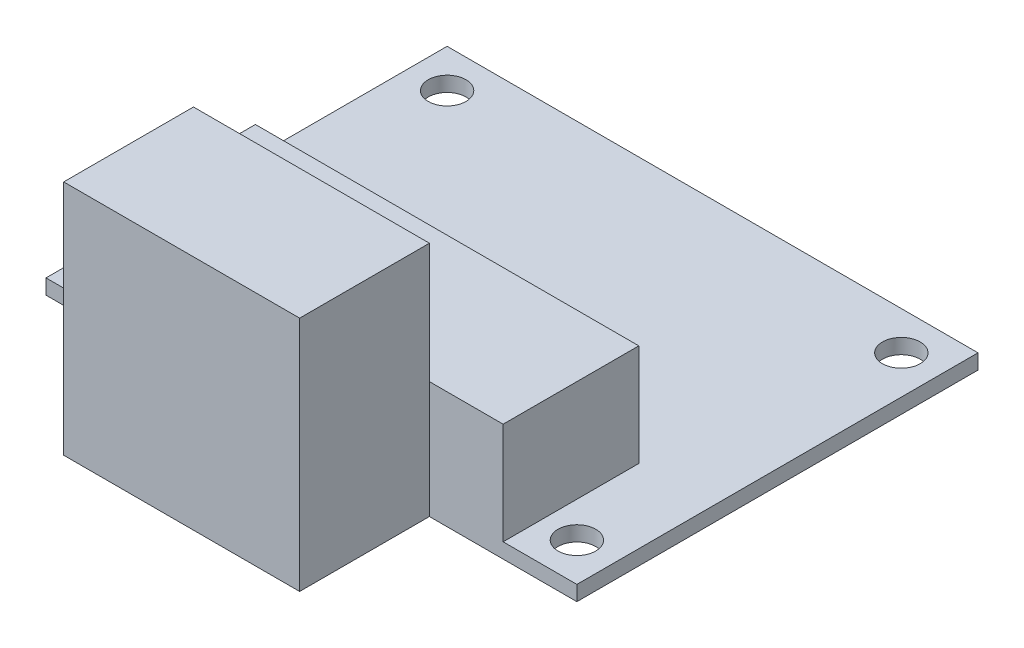
ISO-10303-21;
HEADER;
FILE_DESCRIPTION(('STEP AP214'),'2;1');
FILE_NAME('part.step','',(''),(''),'','','');
FILE_SCHEMA(('AUTOMOTIVE_DESIGN { 1 0 10303 214 1 1 1 1 }'));
ENDSEC;
DATA;
#1=APPLICATION_CONTEXT('core data for automotive mechanical design processes');
#2=APPLICATION_PROTOCOL_DEFINITION('international standard','automotive_design',2000,#1);
#3=PRODUCT_CONTEXT('',#1,'mechanical');
#4=PRODUCT('Part','Part','',(#3));
#5=PRODUCT_RELATED_PRODUCT_CATEGORY('part','',(#4));
#6=PRODUCT_DEFINITION_FORMATION('','',#4);
#7=PRODUCT_DEFINITION_CONTEXT('part definition',#1,'design');
#8=PRODUCT_DEFINITION('design','',#6,#7);
#9=PRODUCT_DEFINITION_SHAPE('','',#8);
#10=(LENGTH_UNIT() NAMED_UNIT(*) SI_UNIT(.MILLI.,.METRE.));
#11=(NAMED_UNIT(*) PLANE_ANGLE_UNIT() SI_UNIT($,.RADIAN.));
#12=(NAMED_UNIT(*) SI_UNIT($,.STERADIAN.) SOLID_ANGLE_UNIT());
#13=UNCERTAINTY_MEASURE_WITH_UNIT(LENGTH_MEASURE(1.E-05),#10,'distance_accuracy_value','');
#14=(GEOMETRIC_REPRESENTATION_CONTEXT(3) GLOBAL_UNCERTAINTY_ASSIGNED_CONTEXT((#13)) GLOBAL_UNIT_ASSIGNED_CONTEXT((#10,
#11,#12)) REPRESENTATION_CONTEXT('',''));
#15=CARTESIAN_POINT('',(0.,0.,0.));
#16=DIRECTION('',(0.,0.,1.));
#17=DIRECTION('',(1.,0.,0.));
#18=AXIS2_PLACEMENT_3D('',#15,#16,#17);
#19=CARTESIAN_POINT('',(22.5,-10.033,11.5));
#20=DIRECTION('',(0.,0.,-1.));
#21=DIRECTION('',(-1.,0.,0.));
#22=AXIS2_PLACEMENT_3D('',#19,#20,#21);
#23=PLANE('',#22);
#24=DIRECTION('',(1.,0.,0.));
#25=VECTOR('',#24,1.);
#26=CARTESIAN_POINT('',(0.,-0.127,11.5));
#27=LINE('',#26,#25);
#28=CARTESIAN_POINT('',(10.,-0.127,11.5));
#29=VERTEX_POINT('',#28);
#30=CARTESIAN_POINT('',(16.2485604026846,-0.127,11.5));
#31=VERTEX_POINT('',#30);
#32=EDGE_CURVE('E128',#29,#31,#27,.T.);
#33=ORIENTED_EDGE('',*,*,#32,.F.);
#34=DIRECTION('',(0.,1.,0.));
#35=VECTOR('',#34,1.);
#36=CARTESIAN_POINT('',(10.,-10.033,11.5));
#37=LINE('',#36,#35);
#38=CARTESIAN_POINT('',(10.,-10.033,11.5));
#39=VERTEX_POINT('',#38);
#40=EDGE_CURVE('E193',#39,#29,#37,.T.);
#41=ORIENTED_EDGE('',*,*,#40,.F.);
#42=DIRECTION('',(-1.,0.,0.));
#43=VECTOR('',#42,1.);
#44=CARTESIAN_POINT('',(22.5,-10.033,11.5));
#45=LINE('',#44,#43);
#46=CARTESIAN_POINT('',(22.5,-10.033,11.5));
#47=VERTEX_POINT('',#46);
#48=EDGE_CURVE('E180',#47,#39,#45,.T.);
#49=ORIENTED_EDGE('',*,*,#48,.F.);
#50=DIRECTION('',(0.,1.,0.));
#51=VECTOR('',#50,1.);
#52=CARTESIAN_POINT('',(22.5,-10.033,11.5));
#53=LINE('',#52,#51);
#54=CARTESIAN_POINT('',(22.5,-8.763,11.5));
#55=VERTEX_POINT('',#54);
#56=EDGE_CURVE('E186',#47,#55,#53,.T.);
#57=ORIENTED_EDGE('',*,*,#56,.T.);
#58=DIRECTION('',(1.,0.,0.));
#59=VECTOR('',#58,1.);
#60=CARTESIAN_POINT('',(0.,-8.763,11.5));
#61=LINE('',#60,#59);
#62=CARTESIAN_POINT('',(16.2485604026846,-8.763,11.5));
#63=VERTEX_POINT('',#62);
#64=EDGE_CURVE('E151',#63,#55,#61,.T.);
#65=ORIENTED_EDGE('',*,*,#64,.F.);
#66=DIRECTION('',(0.,1.,0.));
#67=VECTOR('',#66,1.);
#68=CARTESIAN_POINT('',(16.2485604026846,-8.763,11.5));
#69=LINE('',#68,#67);
#70=EDGE_CURVE('E144',#63,#31,#69,.T.);
#71=ORIENTED_EDGE('',*,*,#70,.T.);
#72=EDGE_LOOP('',(#33,#41,#49,#57,#65,#71));
#73=FACE_BOUND('',#72,.T.);
#74=ADVANCED_FACE('F34',(#73),#23,.F.);
#75=CARTESIAN_POINT('',(-22.5,-10.033,11.5));
#76=DIRECTION('',(0.,0.,1.));
#77=DIRECTION('',(1.,0.,0.));
#78=AXIS2_PLACEMENT_3D('',#75,#76,#77);
#79=PLANE('',#78);
#80=DIRECTION('',(0.,1.,0.));
#81=VECTOR('',#80,1.);
#82=CARTESIAN_POINT('',(-10.,-10.033,11.5));
#83=LINE('',#82,#81);
#84=CARTESIAN_POINT('',(-10.,-10.033,11.5));
#85=VERTEX_POINT('',#84);
#86=CARTESIAN_POINT('',(-10.,-0.127,11.5));
#87=VERTEX_POINT('',#86);
#88=EDGE_CURVE('E176',#85,#87,#83,.T.);
#89=ORIENTED_EDGE('',*,*,#88,.T.);
#90=CARTESIAN_POINT('',(-16.25,-0.127,11.5));
#91=VERTEX_POINT('',#90);
#92=EDGE_CURVE('E140',#91,#87,#27,.T.);
#93=ORIENTED_EDGE('',*,*,#92,.F.);
#94=DIRECTION('',(0.,1.,0.));
#95=VECTOR('',#94,1.);
#96=CARTESIAN_POINT('',(-16.25,-8.763,11.5));
#97=LINE('',#96,#95);
#98=CARTESIAN_POINT('',(-16.25,-8.763,11.5));
#99=VERTEX_POINT('',#98);
#100=EDGE_CURVE('E152',#99,#91,#97,.T.);
#101=ORIENTED_EDGE('',*,*,#100,.F.);
#102=DIRECTION('',(1.,0.,0.));
#103=VECTOR('',#102,1.);
#104=CARTESIAN_POINT('',(0.,-8.763,11.5));
#105=LINE('',#104,#103);
#106=CARTESIAN_POINT('',(-22.5,-8.763,11.5));
#107=VERTEX_POINT('',#106);
#108=EDGE_CURVE('E226',#107,#99,#105,.T.);
#109=ORIENTED_EDGE('',*,*,#108,.F.);
#110=DIRECTION('',(0.,1.,0.));
#111=VECTOR('',#110,1.);
#112=CARTESIAN_POINT('',(-22.5,-10.033,11.5));
#113=LINE('',#112,#111);
#114=CARTESIAN_POINT('',(-22.5,-10.033,11.5));
#115=VERTEX_POINT('',#114);
#116=EDGE_CURVE('E172',#115,#107,#113,.T.);
#117=ORIENTED_EDGE('',*,*,#116,.F.);
#118=DIRECTION('',(1.,0.,0.));
#119=VECTOR('',#118,1.);
#120=CARTESIAN_POINT('',(-22.5,-10.033,11.5));
#121=LINE('',#120,#119);
#122=EDGE_CURVE('E165',#115,#85,#121,.T.);
#123=ORIENTED_EDGE('',*,*,#122,.T.);
#124=EDGE_LOOP('',(#89,#93,#101,#109,#117,#123));
#125=FACE_BOUND('',#124,.T.);
#126=ADVANCED_FACE('F223',(#125),#79,.T.);
#127=CARTESIAN_POINT('',(16.2485604026846,-8.763,0.));
#128=DIRECTION('',(1.,0.,0.));
#129=DIRECTION('',(0.,0.,-1.));
#130=AXIS2_PLACEMENT_3D('',#127,#128,#129);
#131=PLANE('',#130);
#132=DIRECTION('',(0.,1.,0.));
#133=VECTOR('',#132,1.);
#134=CARTESIAN_POINT('',(16.2485604026846,-8.763,0.));
#135=LINE('',#134,#133);
#136=CARTESIAN_POINT('',(16.2485604026846,-8.763,0.));
#137=VERTEX_POINT('',#136);
#138=CARTESIAN_POINT('',(16.2485604026846,-0.127,0.));
#139=VERTEX_POINT('',#138);
#140=EDGE_CURVE('E147',#137,#139,#135,.T.);
#141=ORIENTED_EDGE('',*,*,#140,.T.);
#142=DIRECTION('',(0.,0.,-1.));
#143=VECTOR('',#142,1.);
#144=CARTESIAN_POINT('',(16.2485604026846,-0.127,0.));
#145=LINE('',#144,#143);
#146=EDGE_CURVE('E132',#31,#139,#145,.T.);
#147=ORIENTED_EDGE('',*,*,#146,.F.);
#148=ORIENTED_EDGE('',*,*,#70,.F.);
#149=DIRECTION('',(0.,0.,-1.));
#150=VECTOR('',#149,1.);
#151=CARTESIAN_POINT('',(16.2485604026846,-8.763,0.));
#152=LINE('',#151,#150);
#153=EDGE_CURVE('E242',#63,#137,#152,.T.);
#154=ORIENTED_EDGE('',*,*,#153,.T.);
#155=EDGE_LOOP('',(#141,#147,#148,#154));
#156=FACE_BOUND('',#155,.T.);
#157=ADVANCED_FACE('F143',(#156),#131,.T.);
#158=CARTESIAN_POINT('',(0.,-8.763,0.));
#159=DIRECTION('',(0.,0.,1.));
#160=DIRECTION('',(1.,0.,0.));
#161=AXIS2_PLACEMENT_3D('',#158,#159,#160);
#162=PLANE('',#161);
#163=DIRECTION('',(1.,0.,0.));
#164=VECTOR('',#163,1.);
#165=CARTESIAN_POINT('',(0.,-0.127,0.));
#166=LINE('',#165,#164);
#167=CARTESIAN_POINT('',(-16.25,-0.127,0.));
#168=VERTEX_POINT('',#167);
#169=EDGE_CURVE('E49',#168,#139,#166,.T.);
#170=ORIENTED_EDGE('',*,*,#169,.T.);
#171=ORIENTED_EDGE('',*,*,#140,.F.);
#172=DIRECTION('',(1.,0.,0.));
#173=VECTOR('',#172,1.);
#174=CARTESIAN_POINT('',(0.,-8.763,0.));
#175=LINE('',#174,#173);
#176=CARTESIAN_POINT('',(-16.25,-8.763,0.));
#177=VERTEX_POINT('',#176);
#178=EDGE_CURVE('E153',#177,#137,#175,.T.);
#179=ORIENTED_EDGE('',*,*,#178,.F.);
#180=DIRECTION('',(0.,1.,0.));
#181=VECTOR('',#180,1.);
#182=CARTESIAN_POINT('',(-16.25,-8.763,0.));
#183=LINE('',#182,#181);
#184=EDGE_CURVE('E156',#177,#168,#183,.T.);
#185=ORIENTED_EDGE('',*,*,#184,.T.);
#186=EDGE_LOOP('',(#170,#171,#179,#185));
#187=FACE_BOUND('',#186,.T.);
#188=ADVANCED_FACE('F237',(#187),#162,.F.);
#189=CARTESIAN_POINT('',(-16.25,-8.763,0.));
#190=DIRECTION('',(1.,0.,0.));
#191=DIRECTION('',(0.,0.,-1.));
#192=AXIS2_PLACEMENT_3D('',#189,#190,#191);
#193=PLANE('',#192);
#194=DIRECTION('',(0.,0.,-1.));
#195=VECTOR('',#194,1.);
#196=CARTESIAN_POINT('',(-16.25,-0.127,0.));
#197=LINE('',#196,#195);
#198=EDGE_CURVE('E240',#91,#168,#197,.T.);
#199=ORIENTED_EDGE('',*,*,#198,.T.);
#200=ORIENTED_EDGE('',*,*,#184,.F.);
#201=DIRECTION('',(0.,0.,-1.));
#202=VECTOR('',#201,1.);
#203=CARTESIAN_POINT('',(-16.25,-8.763,0.));
#204=LINE('',#203,#202);
#205=EDGE_CURVE('E159',#99,#177,#204,.T.);
#206=ORIENTED_EDGE('',*,*,#205,.F.);
#207=ORIENTED_EDGE('',*,*,#100,.T.);
#208=EDGE_LOOP('',(#199,#200,#206,#207));
#209=FACE_BOUND('',#208,.T.);
#210=ADVANCED_FACE('F239',(#209),#193,.F.);
#211=CARTESIAN_POINT('',(-22.5,10.033,22.5));
#212=DIRECTION('',(1.,0.,0.));
#213=DIRECTION('',(0.,0.,-1.));
#214=AXIS2_PLACEMENT_3D('',#211,#212,#213);
#215=PLANE('',#214);
#216=DIRECTION('',(0.,0.,1.));
#217=VECTOR('',#216,1.);
#218=CARTESIAN_POINT('',(-22.5,-8.763,0.));
#219=LINE('',#218,#217);
#220=CARTESIAN_POINT('',(-22.5,-8.763,-22.5));
#221=VERTEX_POINT('',#220);
#222=EDGE_CURVE('E57',#221,#107,#219,.T.);
#223=ORIENTED_EDGE('',*,*,#222,.F.);
#224=DIRECTION('',(0.,-1.,0.));
#225=VECTOR('',#224,1.);
#226=CARTESIAN_POINT('',(-22.5,10.033,-22.5));
#227=LINE('',#226,#225);
#228=CARTESIAN_POINT('',(-22.5,-10.033,-22.5));
#229=VERTEX_POINT('',#228);
#230=EDGE_CURVE('E42',#221,#229,#227,.T.);
#231=ORIENTED_EDGE('',*,*,#230,.T.);
#232=DIRECTION('',(0.,0.,1.));
#233=VECTOR('',#232,1.);
#234=CARTESIAN_POINT('',(-22.5,-10.033,22.5));
#235=LINE('',#234,#233);
#236=EDGE_CURVE('E204',#229,#115,#235,.T.);
#237=ORIENTED_EDGE('',*,*,#236,.T.);
#238=ORIENTED_EDGE('',*,*,#116,.T.);
#239=EDGE_LOOP('',(#223,#231,#237,#238));
#240=FACE_BOUND('',#239,.T.);
#241=ADVANCED_FACE('F209',(#240),#215,.F.);
#242=CARTESIAN_POINT('',(0.,10.033,0.));
#243=DIRECTION('',(0.,-1.,0.));
#244=DIRECTION('',(0.,0.,-1.));
#245=AXIS2_PLACEMENT_3D('',#242,#243,#244);
#246=PLANE('',#245);
#247=DIRECTION('',(0.,0.,1.));
#248=VECTOR('',#247,1.);
#249=CARTESIAN_POINT('',(10.,10.033,22.5));
#250=LINE('',#249,#248);
#251=CARTESIAN_POINT('',(10.,10.033,11.5));
#252=VERTEX_POINT('',#251);
#253=CARTESIAN_POINT('',(10.,10.033,22.5));
#254=VERTEX_POINT('',#253);
#255=EDGE_CURVE('E175',#252,#254,#250,.T.);
#256=ORIENTED_EDGE('',*,*,#255,.F.);
#257=DIRECTION('',(1.,0.,0.));
#258=VECTOR('',#257,1.);
#259=CARTESIAN_POINT('',(0.,10.033,11.5));
#260=LINE('',#259,#258);
#261=CARTESIAN_POINT('',(-10.,10.033,11.5));
#262=VERTEX_POINT('',#261);
#263=EDGE_CURVE('E138',#262,#252,#260,.T.);
#264=ORIENTED_EDGE('',*,*,#263,.F.);
#265=DIRECTION('',(0.,0.,1.));
#266=VECTOR('',#265,1.);
#267=CARTESIAN_POINT('',(-10.,10.033,22.5));
#268=LINE('',#267,#266);
#269=CARTESIAN_POINT('',(-10.,10.033,22.5));
#270=VERTEX_POINT('',#269);
#271=EDGE_CURVE('E166',#262,#270,#268,.T.);
#272=ORIENTED_EDGE('',*,*,#271,.T.);
#273=DIRECTION('',(1.,0.,0.));
#274=VECTOR('',#273,1.);
#275=CARTESIAN_POINT('',(-22.5,10.033,22.5));
#276=LINE('',#275,#274);
#277=EDGE_CURVE('E196',#270,#254,#276,.T.);
#278=ORIENTED_EDGE('',*,*,#277,.T.);
#279=EDGE_LOOP('',(#256,#264,#272,#278));
#280=FACE_BOUND('',#279,.T.);
#281=ADVANCED_FACE('F269',(#280),#246,.F.);
#282=CARTESIAN_POINT('',(22.5,10.033,22.5));
#283=DIRECTION('',(-1.,0.,0.));
#284=DIRECTION('',(0.,0.,1.));
#285=AXIS2_PLACEMENT_3D('',#282,#283,#284);
#286=PLANE('',#285);
#287=DIRECTION('',(0.,0.,-1.));
#288=VECTOR('',#287,1.);
#289=CARTESIAN_POINT('',(22.5,-8.763,0.));
#290=LINE('',#289,#288);
#291=CARTESIAN_POINT('',(22.5,-8.763,-22.5));
#292=VERTEX_POINT('',#291);
#293=EDGE_CURVE('E246',#55,#292,#290,.T.);
#294=ORIENTED_EDGE('',*,*,#293,.F.);
#295=ORIENTED_EDGE('',*,*,#56,.F.);
#296=DIRECTION('',(0.,0.,-1.));
#297=VECTOR('',#296,1.);
#298=CARTESIAN_POINT('',(22.5,-10.033,22.5));
#299=LINE('',#298,#297);
#300=CARTESIAN_POINT('',(22.5,-10.033,-22.5));
#301=VERTEX_POINT('',#300);
#302=EDGE_CURVE('E192',#47,#301,#299,.T.);
#303=ORIENTED_EDGE('',*,*,#302,.T.);
#304=DIRECTION('',(0.,-1.,0.));
#305=VECTOR('',#304,1.);
#306=CARTESIAN_POINT('',(22.5,10.033,-22.5));
#307=LINE('',#306,#305);
#308=EDGE_CURVE('E11',#292,#301,#307,.T.);
#309=ORIENTED_EDGE('',*,*,#308,.F.);
#310=EDGE_LOOP('',(#294,#295,#303,#309));
#311=FACE_BOUND('',#310,.T.);
#312=ADVANCED_FACE('F36',(#311),#286,.F.);
#313=CARTESIAN_POINT('',(-22.5,10.033,-22.5));
#314=DIRECTION('',(0.,0.,1.));
#315=DIRECTION('',(1.,0.,0.));
#316=AXIS2_PLACEMENT_3D('',#313,#314,#315);
#317=PLANE('',#316);
#318=DIRECTION('',(-1.,0.,0.));
#319=VECTOR('',#318,1.);
#320=CARTESIAN_POINT('',(0.,-8.763,-22.5));
#321=LINE('',#320,#319);
#322=EDGE_CURVE('E230',#292,#221,#321,.T.);
#323=ORIENTED_EDGE('',*,*,#322,.F.);
#324=ORIENTED_EDGE('',*,*,#308,.T.);
#325=DIRECTION('',(-1.,0.,0.));
#326=VECTOR('',#325,1.);
#327=CARTESIAN_POINT('',(-22.5,-10.033,-22.5));
#328=LINE('',#327,#326);
#329=EDGE_CURVE('E201',#301,#229,#328,.T.);
#330=ORIENTED_EDGE('',*,*,#329,.T.);
#331=ORIENTED_EDGE('',*,*,#230,.F.);
#332=EDGE_LOOP('',(#323,#324,#330,#331));
#333=FACE_BOUND('',#332,.T.);
#334=ADVANCED_FACE('F214',(#333),#317,.F.);
#335=CARTESIAN_POINT('',(-22.5,10.033,22.5));
#336=DIRECTION('',(0.,0.,-1.));
#337=DIRECTION('',(-1.,0.,0.));
#338=AXIS2_PLACEMENT_3D('',#335,#336,#337);
#339=PLANE('',#338);
#340=DIRECTION('',(0.,1.,0.));
#341=VECTOR('',#340,1.);
#342=CARTESIAN_POINT('',(-10.,-10.033,22.5));
#343=LINE('',#342,#341);
#344=CARTESIAN_POINT('',(-10.,-10.033,22.5));
#345=VERTEX_POINT('',#344);
#346=EDGE_CURVE('E169',#345,#270,#343,.T.);
#347=ORIENTED_EDGE('',*,*,#346,.F.);
#348=DIRECTION('',(1.,0.,0.));
#349=VECTOR('',#348,1.);
#350=CARTESIAN_POINT('',(-22.5,-10.033,22.5));
#351=LINE('',#350,#349);
#352=CARTESIAN_POINT('',(10.,-10.033,22.5));
#353=VERTEX_POINT('',#352);
#354=EDGE_CURVE('E198',#345,#353,#351,.T.);
#355=ORIENTED_EDGE('',*,*,#354,.T.);
#356=DIRECTION('',(0.,1.,0.));
#357=VECTOR('',#356,1.);
#358=CARTESIAN_POINT('',(10.,-10.033,22.5));
#359=LINE('',#358,#357);
#360=EDGE_CURVE('E189',#353,#254,#359,.T.);
#361=ORIENTED_EDGE('',*,*,#360,.T.);
#362=ORIENTED_EDGE('',*,*,#277,.F.);
#363=EDGE_LOOP('',(#347,#355,#361,#362));
#364=FACE_BOUND('',#363,.T.);
#365=ADVANCED_FACE('F262',(#364),#339,.F.);
#366=CARTESIAN_POINT('',(0.,-10.033,0.));
#367=DIRECTION('',(0.,-1.,0.));
#368=DIRECTION('',(0.,0.,-1.));
#369=AXIS2_PLACEMENT_3D('',#366,#367,#368);
#370=PLANE('',#369);
#371=CARTESIAN_POINT('',(-19.25,-10.033,-19.25));
#372=DIRECTION('',(0.,-1.,0.));
#373=DIRECTION('',(0.,0.,-1.));
#374=AXIS2_PLACEMENT_3D('',#371,#372,#373);
#375=CIRCLE('',#374,1.6);
#376=CARTESIAN_POINT('',(-19.25,-10.033,-20.85));
#377=VERTEX_POINT('',#376);
#378=EDGE_CURVE('E293',#377,#377,#375,.T.);
#379=ORIENTED_EDGE('',*,*,#378,.F.);
#380=EDGE_LOOP('',(#379));
#381=FACE_BOUND('',#380,.T.);
#382=CARTESIAN_POINT('',(-19.25,-10.033,8.25));
#383=DIRECTION('',(0.,-1.,0.));
#384=DIRECTION('',(0.,0.,-1.));
#385=AXIS2_PLACEMENT_3D('',#382,#383,#384);
#386=CIRCLE('',#385,1.6);
#387=CARTESIAN_POINT('',(-19.25,-10.033,6.65));
#388=VERTEX_POINT('',#387);
#389=EDGE_CURVE('E287',#388,#388,#386,.T.);
#390=ORIENTED_EDGE('',*,*,#389,.F.);
#391=EDGE_LOOP('',(#390));
#392=FACE_BOUND('',#391,.T.);
#393=CARTESIAN_POINT('',(19.25,-10.033,8.25));
#394=DIRECTION('',(0.,-1.,0.));
#395=DIRECTION('',(0.,0.,-1.));
#396=AXIS2_PLACEMENT_3D('',#393,#394,#395);
#397=CIRCLE('',#396,1.6);
#398=CARTESIAN_POINT('',(19.25,-10.033,6.65));
#399=VERTEX_POINT('',#398);
#400=EDGE_CURVE('E281',#399,#399,#397,.T.);
#401=ORIENTED_EDGE('',*,*,#400,.F.);
#402=EDGE_LOOP('',(#401));
#403=FACE_BOUND('',#402,.T.);
#404=CARTESIAN_POINT('',(19.25,-10.033,-19.25));
#405=DIRECTION('',(0.,-1.,0.));
#406=DIRECTION('',(0.,0.,-1.));
#407=AXIS2_PLACEMENT_3D('',#404,#405,#406);
#408=CIRCLE('',#407,1.6);
#409=CARTESIAN_POINT('',(19.25,-10.033,-20.85));
#410=VERTEX_POINT('',#409);
#411=EDGE_CURVE('E271',#410,#410,#408,.T.);
#412=ORIENTED_EDGE('',*,*,#411,.F.);
#413=EDGE_LOOP('',(#412));
#414=FACE_BOUND('',#413,.T.);
#415=DIRECTION('',(0.,0.,1.));
#416=VECTOR('',#415,1.);
#417=CARTESIAN_POINT('',(-10.,-10.033,22.5));
#418=LINE('',#417,#416);
#419=EDGE_CURVE('E163',#85,#345,#418,.T.);
#420=ORIENTED_EDGE('',*,*,#419,.F.);
#421=ORIENTED_EDGE('',*,*,#122,.F.);
#422=ORIENTED_EDGE('',*,*,#236,.F.);
#423=ORIENTED_EDGE('',*,*,#329,.F.);
#424=ORIENTED_EDGE('',*,*,#302,.F.);
#425=ORIENTED_EDGE('',*,*,#48,.T.);
#426=DIRECTION('',(0.,0.,1.));
#427=VECTOR('',#426,1.);
#428=CARTESIAN_POINT('',(10.,-10.033,22.5));
#429=LINE('',#428,#427);
#430=EDGE_CURVE('E183',#39,#353,#429,.T.);
#431=ORIENTED_EDGE('',*,*,#430,.T.);
#432=ORIENTED_EDGE('',*,*,#354,.F.);
#433=EDGE_LOOP('',(#420,#421,#422,#423,#424,#425,#431,#432));
#434=FACE_BOUND('',#433,.T.);
#435=ADVANCED_FACE('F220',(#381,#392,#403,#414,#434),#370,.T.);
#436=CARTESIAN_POINT('',(10.,-10.033,22.5));
#437=DIRECTION('',(-1.,0.,0.));
#438=DIRECTION('',(0.,0.,1.));
#439=AXIS2_PLACEMENT_3D('',#436,#437,#438);
#440=PLANE('',#439);
#441=ORIENTED_EDGE('',*,*,#255,.T.);
#442=ORIENTED_EDGE('',*,*,#360,.F.);
#443=ORIENTED_EDGE('',*,*,#430,.F.);
#444=ORIENTED_EDGE('',*,*,#40,.T.);
#445=DIRECTION('',(0.,1.,0.));
#446=VECTOR('',#445,1.);
#447=CARTESIAN_POINT('',(10.,-10.033,11.5));
#448=LINE('',#447,#446);
#449=EDGE_CURVE('E244',#29,#252,#448,.T.);
#450=ORIENTED_EDGE('',*,*,#449,.T.);
#451=EDGE_LOOP('',(#441,#442,#443,#444,#450));
#452=FACE_BOUND('',#451,.T.);
#453=ADVANCED_FACE('F256',(#452),#440,.F.);
#454=CARTESIAN_POINT('',(-10.,-10.033,22.5));
#455=DIRECTION('',(-1.,0.,0.));
#456=DIRECTION('',(0.,0.,1.));
#457=AXIS2_PLACEMENT_3D('',#454,#455,#456);
#458=PLANE('',#457);
#459=ORIENTED_EDGE('',*,*,#271,.F.);
#460=DIRECTION('',(0.,1.,0.));
#461=VECTOR('',#460,1.);
#462=CARTESIAN_POINT('',(-10.,-10.033,11.5));
#463=LINE('',#462,#461);
#464=EDGE_CURVE('E249',#87,#262,#463,.T.);
#465=ORIENTED_EDGE('',*,*,#464,.F.);
#466=ORIENTED_EDGE('',*,*,#88,.F.);
#467=ORIENTED_EDGE('',*,*,#419,.T.);
#468=ORIENTED_EDGE('',*,*,#346,.T.);
#469=EDGE_LOOP('',(#459,#465,#466,#467,#468));
#470=FACE_BOUND('',#469,.T.);
#471=ADVANCED_FACE('F265',(#470),#458,.T.);
#472=CARTESIAN_POINT('',(0.,-8.763,0.));
#473=DIRECTION('',(0.,1.,0.));
#474=DIRECTION('',(0.,0.,1.));
#475=AXIS2_PLACEMENT_3D('',#472,#473,#474);
#476=PLANE('',#475);
#477=CARTESIAN_POINT('',(-19.25,-8.763,-19.25));
#478=DIRECTION('',(0.,1.,0.));
#479=DIRECTION('',(0.,0.,1.));
#480=AXIS2_PLACEMENT_3D('',#477,#478,#479);
#481=CIRCLE('',#480,1.6);
#482=CARTESIAN_POINT('',(-19.25,-8.763,-17.65));
#483=VERTEX_POINT('',#482);
#484=EDGE_CURVE('E296',#483,#483,#481,.T.);
#485=ORIENTED_EDGE('',*,*,#484,.F.);
#486=EDGE_LOOP('',(#485));
#487=FACE_BOUND('',#486,.T.);
#488=CARTESIAN_POINT('',(-19.25,-8.763,8.25));
#489=DIRECTION('',(0.,1.,0.));
#490=DIRECTION('',(0.,0.,1.));
#491=AXIS2_PLACEMENT_3D('',#488,#489,#490);
#492=CIRCLE('',#491,1.6);
#493=CARTESIAN_POINT('',(-19.25,-8.763,9.85));
#494=VERTEX_POINT('',#493);
#495=EDGE_CURVE('E290',#494,#494,#492,.T.);
#496=ORIENTED_EDGE('',*,*,#495,.F.);
#497=EDGE_LOOP('',(#496));
#498=FACE_BOUND('',#497,.T.);
#499=CARTESIAN_POINT('',(19.25,-8.763,8.25));
#500=DIRECTION('',(0.,1.,0.));
#501=DIRECTION('',(0.,0.,1.));
#502=AXIS2_PLACEMENT_3D('',#499,#500,#501);
#503=CIRCLE('',#502,1.6);
#504=CARTESIAN_POINT('',(19.25,-8.763,9.85));
#505=VERTEX_POINT('',#504);
#506=EDGE_CURVE('E284',#505,#505,#503,.T.);
#507=ORIENTED_EDGE('',*,*,#506,.F.);
#508=EDGE_LOOP('',(#507));
#509=FACE_BOUND('',#508,.T.);
#510=CARTESIAN_POINT('',(19.25,-8.763,-19.25));
#511=DIRECTION('',(0.,1.,0.));
#512=DIRECTION('',(0.,0.,1.));
#513=AXIS2_PLACEMENT_3D('',#510,#511,#512);
#514=CIRCLE('',#513,1.6);
#515=CARTESIAN_POINT('',(19.25,-8.763,-17.65));
#516=VERTEX_POINT('',#515);
#517=EDGE_CURVE('E274',#516,#516,#514,.T.);
#518=ORIENTED_EDGE('',*,*,#517,.F.);
#519=EDGE_LOOP('',(#518));
#520=FACE_BOUND('',#519,.T.);
#521=ORIENTED_EDGE('',*,*,#153,.F.);
#522=ORIENTED_EDGE('',*,*,#64,.T.);
#523=ORIENTED_EDGE('',*,*,#293,.T.);
#524=ORIENTED_EDGE('',*,*,#322,.T.);
#525=ORIENTED_EDGE('',*,*,#222,.T.);
#526=ORIENTED_EDGE('',*,*,#108,.T.);
#527=ORIENTED_EDGE('',*,*,#205,.T.);
#528=ORIENTED_EDGE('',*,*,#178,.T.);
#529=EDGE_LOOP('',(#521,#522,#523,#524,#525,#526,#527,#528));
#530=FACE_BOUND('',#529,.T.);
#531=ADVANCED_FACE('F241',(#487,#498,#509,#520,#530),#476,.T.);
#532=CARTESIAN_POINT('',(0.,-0.127,11.5));
#533=DIRECTION('',(0.,0.,1.));
#534=DIRECTION('',(1.,0.,0.));
#535=AXIS2_PLACEMENT_3D('',#532,#533,#534);
#536=PLANE('',#535);
#537=EDGE_CURVE('E133',#87,#29,#27,.T.);
#538=ORIENTED_EDGE('',*,*,#537,.F.);
#539=ORIENTED_EDGE('',*,*,#464,.T.);
#540=ORIENTED_EDGE('',*,*,#263,.T.);
#541=ORIENTED_EDGE('',*,*,#449,.F.);
#542=EDGE_LOOP('',(#538,#539,#540,#541));
#543=FACE_BOUND('',#542,.T.);
#544=ADVANCED_FACE('F305',(#543),#536,.F.);
#545=CARTESIAN_POINT('',(0.,-0.127,0.));
#546=DIRECTION('',(0.,1.,0.));
#547=DIRECTION('',(0.,0.,1.));
#548=AXIS2_PLACEMENT_3D('',#545,#546,#547);
#549=PLANE('',#548);
#550=ORIENTED_EDGE('',*,*,#92,.T.);
#551=ORIENTED_EDGE('',*,*,#537,.T.);
#552=ORIENTED_EDGE('',*,*,#32,.T.);
#553=ORIENTED_EDGE('',*,*,#146,.T.);
#554=ORIENTED_EDGE('',*,*,#169,.F.);
#555=ORIENTED_EDGE('',*,*,#198,.F.);
#556=EDGE_LOOP('',(#550,#551,#552,#553,#554,#555));
#557=FACE_BOUND('',#556,.T.);
#558=ADVANCED_FACE('F131',(#557),#549,.T.);
#559=CARTESIAN_POINT('',(19.25,-8.763,-19.25));
#560=DIRECTION('',(0.,1.,0.));
#561=DIRECTION('',(0.,0.,1.));
#562=AXIS2_PLACEMENT_3D('',#559,#560,#561);
#563=CYLINDRICAL_SURFACE('',#562,1.6);
#564=ORIENTED_EDGE('',*,*,#517,.T.);
#565=EDGE_LOOP('',(#564));
#566=FACE_BOUND('',#565,.T.);
#567=ORIENTED_EDGE('',*,*,#411,.T.);
#568=EDGE_LOOP('',(#567));
#569=FACE_BOUND('',#568,.T.);
#570=ADVANCED_FACE('F313',(#566,#569),#563,.F.);
#571=CARTESIAN_POINT('',(19.25,-8.763,8.25));
#572=DIRECTION('',(0.,1.,0.));
#573=DIRECTION('',(0.,0.,1.));
#574=AXIS2_PLACEMENT_3D('',#571,#572,#573);
#575=CYLINDRICAL_SURFACE('',#574,1.6);
#576=ORIENTED_EDGE('',*,*,#506,.T.);
#577=EDGE_LOOP('',(#576));
#578=FACE_BOUND('',#577,.T.);
#579=ORIENTED_EDGE('',*,*,#400,.T.);
#580=EDGE_LOOP('',(#579));
#581=FACE_BOUND('',#580,.T.);
#582=ADVANCED_FACE('F316',(#578,#581),#575,.F.);
#583=CARTESIAN_POINT('',(-19.25,-8.763,8.25));
#584=DIRECTION('',(0.,1.,0.));
#585=DIRECTION('',(0.,0.,1.));
#586=AXIS2_PLACEMENT_3D('',#583,#584,#585);
#587=CYLINDRICAL_SURFACE('',#586,1.6);
#588=ORIENTED_EDGE('',*,*,#495,.T.);
#589=EDGE_LOOP('',(#588));
#590=FACE_BOUND('',#589,.T.);
#591=ORIENTED_EDGE('',*,*,#389,.T.);
#592=EDGE_LOOP('',(#591));
#593=FACE_BOUND('',#592,.T.);
#594=ADVANCED_FACE('F431',(#590,#593),#587,.F.);
#595=CARTESIAN_POINT('',(-19.25,-8.763,-19.25));
#596=DIRECTION('',(0.,1.,0.));
#597=DIRECTION('',(0.,0.,1.));
#598=AXIS2_PLACEMENT_3D('',#595,#596,#597);
#599=CYLINDRICAL_SURFACE('',#598,1.6);
#600=ORIENTED_EDGE('',*,*,#484,.T.);
#601=EDGE_LOOP('',(#600));
#602=FACE_BOUND('',#601,.T.);
#603=ORIENTED_EDGE('',*,*,#378,.T.);
#604=EDGE_LOOP('',(#603));
#605=FACE_BOUND('',#604,.T.);
#606=ADVANCED_FACE('F300',(#602,#605),#599,.F.);
#607=CLOSED_SHELL('',(#74,#126,#157,#188,#210,#241,#281,#312,#334,#365,#435,#453,#471,#531,#544,
#558,#570,#582,#594,#606));
#608=MANIFOLD_SOLID_BREP('B2',#607);
#609=ADVANCED_BREP_SHAPE_REPRESENTATION('',(#18,#608),#14);
#610=SHAPE_DEFINITION_REPRESENTATION(#9,#609);
ENDSEC;
END-ISO-10303-21;
